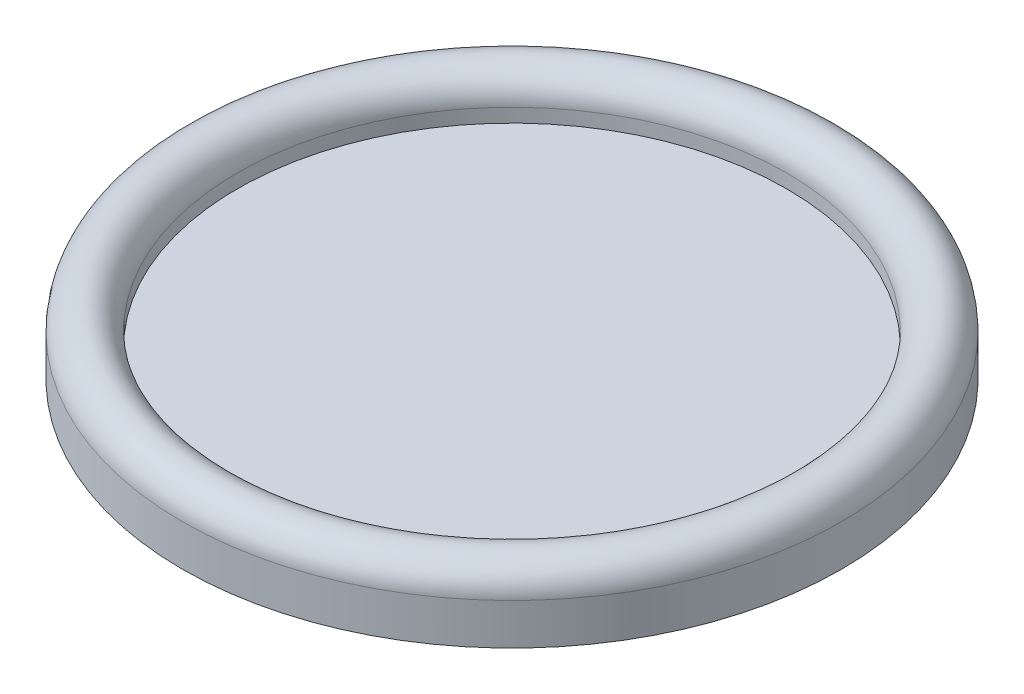
ISO-10303-21;
HEADER;
FILE_DESCRIPTION(('STEP AP214'),'2;1');
FILE_NAME('part.step','',(''),(''),'','','');
FILE_SCHEMA(('AUTOMOTIVE_DESIGN { 1 0 10303 214 1 1 1 1 }'));
ENDSEC;
DATA;
#1=APPLICATION_CONTEXT('core data for automotive mechanical design processes');
#2=APPLICATION_PROTOCOL_DEFINITION('international standard','automotive_design',2000,#1);
#3=PRODUCT_CONTEXT('',#1,'mechanical');
#4=PRODUCT('Part','Part','',(#3));
#5=PRODUCT_RELATED_PRODUCT_CATEGORY('part','',(#4));
#6=PRODUCT_DEFINITION_FORMATION('','',#4);
#7=PRODUCT_DEFINITION_CONTEXT('part definition',#1,'design');
#8=PRODUCT_DEFINITION('design','',#6,#7);
#9=PRODUCT_DEFINITION_SHAPE('','',#8);
#10=(LENGTH_UNIT() NAMED_UNIT(*) SI_UNIT(.MILLI.,.METRE.));
#11=(NAMED_UNIT(*) PLANE_ANGLE_UNIT() SI_UNIT($,.RADIAN.));
#12=(NAMED_UNIT(*) SI_UNIT($,.STERADIAN.) SOLID_ANGLE_UNIT());
#13=UNCERTAINTY_MEASURE_WITH_UNIT(LENGTH_MEASURE(1.E-05),#10,'distance_accuracy_value','');
#14=(GEOMETRIC_REPRESENTATION_CONTEXT(3) GLOBAL_UNCERTAINTY_ASSIGNED_CONTEXT((#13)) GLOBAL_UNIT_ASSIGNED_CONTEXT((#10,
#11,#12)) REPRESENTATION_CONTEXT('',''));
#15=CARTESIAN_POINT('',(0.,0.,0.));
#16=DIRECTION('',(0.,0.,1.));
#17=DIRECTION('',(1.,0.,0.));
#18=AXIS2_PLACEMENT_3D('',#15,#16,#17);
#19=CARTESIAN_POINT('',(0.,9.52499999999999,0.));
#20=DIRECTION('',(0.,1.,0.));
#21=DIRECTION('',(0.,0.,1.));
#22=AXIS2_PLACEMENT_3D('',#19,#20,#21);
#23=TOROIDAL_SURFACE('',#22,69.85,6.35);
#24=CARTESIAN_POINT('',(0.,9.52499999999999,0.));
#25=DIRECTION('',(0.,1.,0.));
#26=DIRECTION('',(0.,0.,1.));
#27=AXIS2_PLACEMENT_3D('',#24,#25,#26);
#28=CIRCLE('',#27,63.5);
#29=CARTESIAN_POINT('',(0.,9.52499999999999,63.5));
#30=VERTEX_POINT('',#29);
#31=EDGE_CURVE('E48',#30,#30,#28,.T.);
#32=ORIENTED_EDGE('',*,*,#31,.F.);
#33=EDGE_LOOP('',(#32));
#34=FACE_BOUND('',#33,.T.);
#35=CARTESIAN_POINT('',(0.,9.52499999999999,0.));
#36=DIRECTION('',(0.,1.,0.));
#37=DIRECTION('',(0.,0.,1.));
#38=AXIS2_PLACEMENT_3D('',#35,#36,#37);
#39=CIRCLE('',#38,76.2);
#40=CARTESIAN_POINT('',(0.,9.52499999999999,76.2));
#41=VERTEX_POINT('',#40);
#42=EDGE_CURVE('E10',#41,#41,#39,.T.);
#43=ORIENTED_EDGE('',*,*,#42,.T.);
#44=EDGE_LOOP('',(#43));
#45=FACE_BOUND('',#44,.T.);
#46=ADVANCED_FACE('F34',(#34,#45),#23,.T.);
#47=CARTESIAN_POINT('',(0.,6.35,0.));
#48=DIRECTION('',(0.,1.,0.));
#49=DIRECTION('',(0.,0.,1.));
#50=AXIS2_PLACEMENT_3D('',#47,#48,#49);
#51=CYLINDRICAL_SURFACE('',#50,76.2);
#52=ORIENTED_EDGE('',*,*,#42,.F.);
#53=EDGE_LOOP('',(#52));
#54=FACE_BOUND('',#53,.T.);
#55=CARTESIAN_POINT('',(0.,0.,0.));
#56=DIRECTION('',(0.,1.,0.));
#57=DIRECTION('',(0.,0.,1.));
#58=AXIS2_PLACEMENT_3D('',#55,#56,#57);
#59=CIRCLE('',#58,76.2);
#60=CARTESIAN_POINT('',(0.,0.,76.2));
#61=VERTEX_POINT('',#60);
#62=EDGE_CURVE('E40',#61,#61,#59,.T.);
#63=ORIENTED_EDGE('',*,*,#62,.T.);
#64=EDGE_LOOP('',(#63));
#65=FACE_BOUND('',#64,.T.);
#66=ADVANCED_FACE('F57',(#54,#65),#51,.T.);
#67=CARTESIAN_POINT('',(0.,207.041553360733,0.));
#68=DIRECTION('',(0.,1.,0.));
#69=DIRECTION('',(1.,0.,0.));
#70=AXIS2_PLACEMENT_3D('',#67,#68,#69);
#71=SPHERICAL_SURFACE('',#70,220.618777120229);
#72=ORIENTED_EDGE('',*,*,#62,.F.);
#73=EDGE_LOOP('',(#72));
#74=FACE_BOUND('',#73,.T.);
#75=ADVANCED_FACE('F61',(#74),#71,.T.);
#76=CARTESIAN_POINT('',(0.,6.34999999999999,0.));
#77=DIRECTION('',(0.,-1.,0.));
#78=DIRECTION('',(0.,0.,-1.));
#79=AXIS2_PLACEMENT_3D('',#76,#77,#78);
#80=PLANE('',#79);
#81=CARTESIAN_POINT('',(0.,6.34999999999999,0.));
#82=DIRECTION('',(0.,1.,0.));
#83=DIRECTION('',(0.,0.,1.));
#84=AXIS2_PLACEMENT_3D('',#81,#82,#83);
#85=CIRCLE('',#84,63.5);
#86=CARTESIAN_POINT('',(0.,6.34999999999999,63.5));
#87=VERTEX_POINT('',#86);
#88=EDGE_CURVE('E44',#87,#87,#85,.T.);
#89=ORIENTED_EDGE('',*,*,#88,.T.);
#90=EDGE_LOOP('',(#89));
#91=FACE_BOUND('',#90,.T.);
#92=ADVANCED_FACE('F66',(#91),#80,.F.);
#93=CARTESIAN_POINT('',(0.,6.35,0.));
#94=DIRECTION('',(0.,1.,0.));
#95=DIRECTION('',(0.,0.,1.));
#96=AXIS2_PLACEMENT_3D('',#93,#94,#95);
#97=CYLINDRICAL_SURFACE('',#96,63.5);
#98=ORIENTED_EDGE('',*,*,#88,.F.);
#99=EDGE_LOOP('',(#98));
#100=FACE_BOUND('',#99,.T.);
#101=ORIENTED_EDGE('',*,*,#31,.T.);
#102=EDGE_LOOP('',(#101));
#103=FACE_BOUND('',#102,.T.);
#104=ADVANCED_FACE('F54',(#100,#103),#97,.F.);
#105=CLOSED_SHELL('',(#46,#66,#75,#92,#104));
#106=MANIFOLD_SOLID_BREP('B2',#105);
#107=ADVANCED_BREP_SHAPE_REPRESENTATION('',(#18,#106),#14);
#108=SHAPE_DEFINITION_REPRESENTATION(#9,#107);
ENDSEC;
END-ISO-10303-21;
